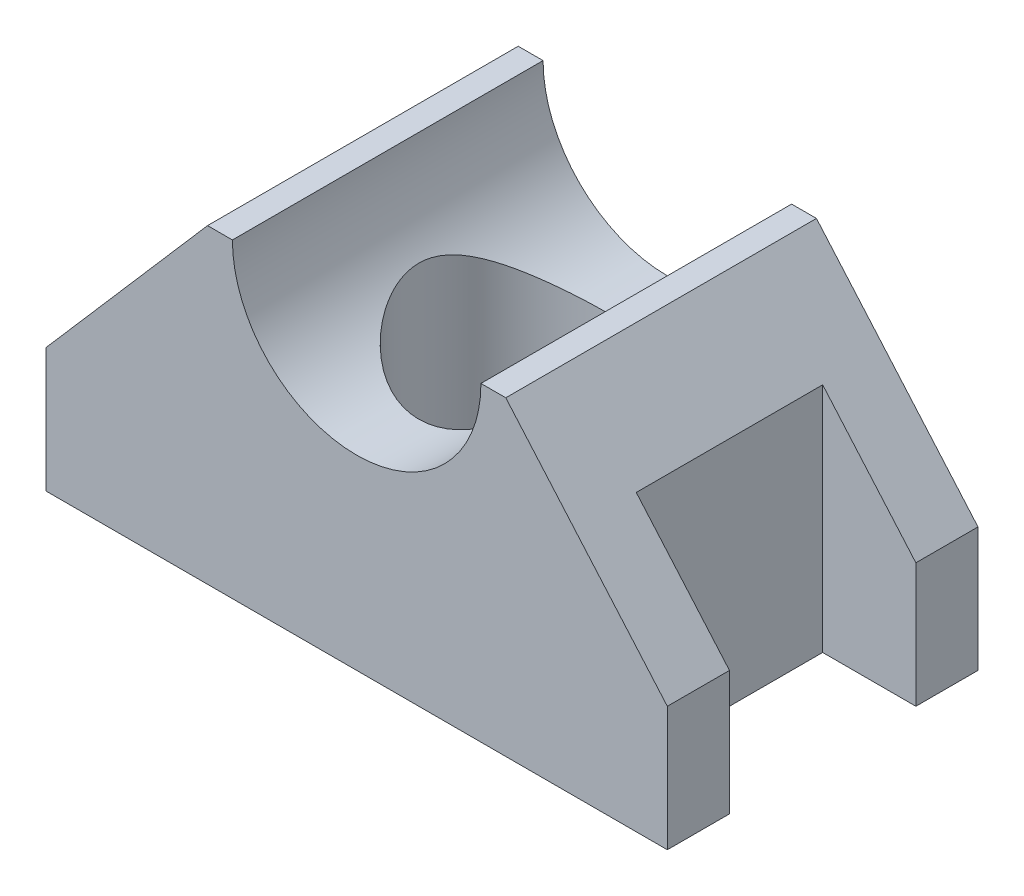
ISO-10303-21;
HEADER;
FILE_DESCRIPTION(('STEP AP214'),'2;1');
FILE_NAME('part.step','',(''),(''),'','','');
FILE_SCHEMA(('AUTOMOTIVE_DESIGN { 1 0 10303 214 1 1 1 1 }'));
ENDSEC;
DATA;
#1=APPLICATION_CONTEXT('core data for automotive mechanical design processes');
#2=APPLICATION_PROTOCOL_DEFINITION('international standard','automotive_design',2000,#1);
#3=PRODUCT_CONTEXT('',#1,'mechanical');
#4=PRODUCT('Part','Part','',(#3));
#5=PRODUCT_RELATED_PRODUCT_CATEGORY('part','',(#4));
#6=PRODUCT_DEFINITION_FORMATION('','',#4);
#7=PRODUCT_DEFINITION_CONTEXT('part definition',#1,'design');
#8=PRODUCT_DEFINITION('design','',#6,#7);
#9=PRODUCT_DEFINITION_SHAPE('','',#8);
#10=(LENGTH_UNIT() NAMED_UNIT(*) SI_UNIT(.MILLI.,.METRE.));
#11=(NAMED_UNIT(*) PLANE_ANGLE_UNIT() SI_UNIT($,.RADIAN.));
#12=(NAMED_UNIT(*) SI_UNIT($,.STERADIAN.) SOLID_ANGLE_UNIT());
#13=UNCERTAINTY_MEASURE_WITH_UNIT(LENGTH_MEASURE(1.E-05),#10,'distance_accuracy_value','');
#14=(GEOMETRIC_REPRESENTATION_CONTEXT(3) GLOBAL_UNCERTAINTY_ASSIGNED_CONTEXT((#13)) GLOBAL_UNIT_ASSIGNED_CONTEXT((#10,
#11,#12)) REPRESENTATION_CONTEXT('',''));
#15=CARTESIAN_POINT('',(0.,0.,0.));
#16=DIRECTION('',(0.,0.,1.));
#17=DIRECTION('',(1.,0.,0.));
#18=AXIS2_PLACEMENT_3D('',#15,#16,#17);
#19=CARTESIAN_POINT('',(-68.1528429856967,0.,-50.));
#20=DIRECTION('',(0.,-1.,0.));
#21=DIRECTION('',(0.,0.,-1.));
#22=AXIS2_PLACEMENT_3D('',#19,#20,#21);
#23=PLANE('',#22);
#24=CARTESIAN_POINT('',(-18.1528429856966,0.,-25.));
#25=DIRECTION('',(0.,1.,0.));
#26=DIRECTION('',(-1.,0.,0.));
#27=AXIS2_PLACEMENT_3D('',#24,#25,#26);
#28=CIRCLE('',#27,15.);
#29=CARTESIAN_POINT('',(-33.1528429856966,0.,-25.));
#30=VERTEX_POINT('',#29);
#31=EDGE_CURVE('E242',#30,#30,#28,.T.);
#32=ORIENTED_EDGE('',*,*,#31,.T.);
#33=EDGE_LOOP('',(#32));
#34=FACE_BOUND('',#33,.T.);
#35=DIRECTION('',(0.,0.,1.));
#36=VECTOR('',#35,1.);
#37=CARTESIAN_POINT('',(31.8471570143033,0.,-50.));
#38=LINE('',#37,#36);
#39=CARTESIAN_POINT('',(31.8471570143033,0.,-50.));
#40=VERTEX_POINT('',#39);
#41=CARTESIAN_POINT('',(31.8471570143033,0.,-40.));
#42=VERTEX_POINT('',#41);
#43=EDGE_CURVE('E173',#40,#42,#38,.T.);
#44=ORIENTED_EDGE('',*,*,#43,.T.);
#45=DIRECTION('',(1.,0.,0.));
#46=VECTOR('',#45,1.);
#47=CARTESIAN_POINT('',(16.8471570143033,0.,-40.));
#48=LINE('',#47,#46);
#49=CARTESIAN_POINT('',(16.8471570143033,0.,-40.));
#50=VERTEX_POINT('',#49);
#51=EDGE_CURVE('E157',#50,#42,#48,.T.);
#52=ORIENTED_EDGE('',*,*,#51,.F.);
#53=DIRECTION('',(0.,0.,1.));
#54=VECTOR('',#53,1.);
#55=CARTESIAN_POINT('',(16.8471570143033,0.,-40.));
#56=LINE('',#55,#54);
#57=CARTESIAN_POINT('',(16.8471570143033,0.,-10.));
#58=VERTEX_POINT('',#57);
#59=EDGE_CURVE('E245',#50,#58,#56,.T.);
#60=ORIENTED_EDGE('',*,*,#59,.T.);
#61=DIRECTION('',(1.,0.,0.));
#62=VECTOR('',#61,1.);
#63=CARTESIAN_POINT('',(16.8471570143033,0.,-10.));
#64=LINE('',#63,#62);
#65=CARTESIAN_POINT('',(31.8471570143033,0.,-10.));
#66=VERTEX_POINT('',#65);
#67=EDGE_CURVE('E260',#58,#66,#64,.T.);
#68=ORIENTED_EDGE('',*,*,#67,.T.);
#69=CARTESIAN_POINT('',(31.8471570143033,0.,0.));
#70=VERTEX_POINT('',#69);
#71=EDGE_CURVE('E182',#66,#70,#38,.T.);
#72=ORIENTED_EDGE('',*,*,#71,.T.);
#73=DIRECTION('',(1.,0.,0.));
#74=VECTOR('',#73,1.);
#75=CARTESIAN_POINT('',(-68.1528429856967,0.,0.));
#76=LINE('',#75,#74);
#77=CARTESIAN_POINT('',(-68.1528429856967,0.,0.));
#78=VERTEX_POINT('',#77);
#79=EDGE_CURVE('E219',#78,#70,#76,.T.);
#80=ORIENTED_EDGE('',*,*,#79,.F.);
#81=DIRECTION('',(0.,0.,1.));
#82=VECTOR('',#81,1.);
#83=CARTESIAN_POINT('',(-68.1528429856967,0.,-50.));
#84=LINE('',#83,#82);
#85=CARTESIAN_POINT('',(-68.1528429856967,0.,-10.));
#86=VERTEX_POINT('',#85);
#87=EDGE_CURVE('E50',#86,#78,#84,.T.);
#88=ORIENTED_EDGE('',*,*,#87,.F.);
#89=DIRECTION('',(1.,0.,0.));
#90=VECTOR('',#89,1.);
#91=CARTESIAN_POINT('',(-53.1528429856967,0.,-10.));
#92=LINE('',#91,#90);
#93=CARTESIAN_POINT('',(-53.1528429856967,0.,-10.));
#94=VERTEX_POINT('',#93);
#95=EDGE_CURVE('E257',#86,#94,#92,.T.);
#96=ORIENTED_EDGE('',*,*,#95,.T.);
#97=DIRECTION('',(0.,0.,1.));
#98=VECTOR('',#97,1.);
#99=CARTESIAN_POINT('',(-53.1528429856967,0.,-40.));
#100=LINE('',#99,#98);
#101=CARTESIAN_POINT('',(-53.1528429856967,0.,-40.));
#102=VERTEX_POINT('',#101);
#103=EDGE_CURVE('E256',#102,#94,#100,.T.);
#104=ORIENTED_EDGE('',*,*,#103,.F.);
#105=DIRECTION('',(1.,0.,0.));
#106=VECTOR('',#105,1.);
#107=CARTESIAN_POINT('',(-53.1528429856967,0.,-40.));
#108=LINE('',#107,#106);
#109=CARTESIAN_POINT('',(-68.1528429856967,0.,-40.));
#110=VERTEX_POINT('',#109);
#111=EDGE_CURVE('E246',#110,#102,#108,.T.);
#112=ORIENTED_EDGE('',*,*,#111,.F.);
#113=CARTESIAN_POINT('',(-68.1528429856967,0.,-50.));
#114=VERTEX_POINT('',#113);
#115=EDGE_CURVE('E11',#114,#110,#84,.T.);
#116=ORIENTED_EDGE('',*,*,#115,.F.);
#117=DIRECTION('',(1.,0.,0.));
#118=VECTOR('',#117,1.);
#119=CARTESIAN_POINT('',(-68.1528429856967,0.,-50.));
#120=LINE('',#119,#118);
#121=EDGE_CURVE('E180',#114,#40,#120,.T.);
#122=ORIENTED_EDGE('',*,*,#121,.T.);
#123=EDGE_LOOP('',(#44,#52,#60,#68,#72,#80,#88,#96,#104,#112,#116,#122));
#124=FACE_BOUND('',#123,.T.);
#125=ADVANCED_FACE('F37',(#34,#124),#23,.T.);
#126=CARTESIAN_POINT('',(-68.1528429856967,0.,-50.));
#127=DIRECTION('',(-1.,0.,0.));
#128=DIRECTION('',(0.,0.,1.));
#129=AXIS2_PLACEMENT_3D('',#126,#127,#128);
#130=PLANE('',#129);
#131=DIRECTION('',(0.,0.,1.));
#132=VECTOR('',#131,1.);
#133=CARTESIAN_POINT('',(-68.1528429856967,20.,-50.));
#134=LINE('',#133,#132);
#135=CARTESIAN_POINT('',(-68.1528429856967,20.,-10.));
#136=VERTEX_POINT('',#135);
#137=CARTESIAN_POINT('',(-68.1528429856967,20.,0.));
#138=VERTEX_POINT('',#137);
#139=EDGE_CURVE('E194',#136,#138,#134,.T.);
#140=ORIENTED_EDGE('',*,*,#139,.F.);
#141=DIRECTION('',(0.,-1.,0.));
#142=VECTOR('',#141,1.);
#143=CARTESIAN_POINT('',(-68.1528429856967,0.,-10.));
#144=LINE('',#143,#142);
#145=EDGE_CURVE('E58',#136,#86,#144,.T.);
#146=ORIENTED_EDGE('',*,*,#145,.T.);
#147=ORIENTED_EDGE('',*,*,#87,.T.);
#148=DIRECTION('',(0.,-1.,0.));
#149=VECTOR('',#148,1.);
#150=CARTESIAN_POINT('',(-68.1528429856967,0.,0.));
#151=LINE('',#150,#149);
#152=EDGE_CURVE('E198',#138,#78,#151,.T.);
#153=ORIENTED_EDGE('',*,*,#152,.F.);
#154=EDGE_LOOP('',(#140,#146,#147,#153));
#155=FACE_BOUND('',#154,.T.);
#156=ADVANCED_FACE('F302',(#155),#130,.T.);
#157=CARTESIAN_POINT('',(31.8471570143033,20.,-50.));
#158=DIRECTION('',(0.755689082789817,0.654930538417842,0.));
#159=DIRECTION('',(-0.654930538417842,0.755689082789817,0.));
#160=AXIS2_PLACEMENT_3D('',#157,#158,#159);
#161=PLANE('',#160);
#162=DIRECTION('',(0.,0.,1.));
#163=VECTOR('',#162,1.);
#164=CARTESIAN_POINT('',(16.8471570143033,37.3076923076923,-40.));
#165=LINE('',#164,#163);
#166=CARTESIAN_POINT('',(16.8471570143033,37.3076923076923,-40.));
#167=VERTEX_POINT('',#166);
#168=CARTESIAN_POINT('',(16.8471570143033,37.3076923076923,-10.));
#169=VERTEX_POINT('',#168);
#170=EDGE_CURVE('E271',#167,#169,#165,.T.);
#171=ORIENTED_EDGE('',*,*,#170,.F.);
#172=DIRECTION('',(-0.654930538417842,0.755689082789818,0.));
#173=VECTOR('',#172,1.);
#174=CARTESIAN_POINT('',(31.8471570143033,20.,-40.));
#175=LINE('',#174,#173);
#176=CARTESIAN_POINT('',(31.8471570143033,20.,-40.));
#177=VERTEX_POINT('',#176);
#178=EDGE_CURVE('E176',#177,#167,#175,.T.);
#179=ORIENTED_EDGE('',*,*,#178,.F.);
#180=DIRECTION('',(0.,0.,1.));
#181=VECTOR('',#180,1.);
#182=CARTESIAN_POINT('',(31.8471570143033,20.,-50.));
#183=LINE('',#182,#181);
#184=CARTESIAN_POINT('',(31.8471570143033,20.,-50.));
#185=VERTEX_POINT('',#184);
#186=EDGE_CURVE('E175',#185,#177,#183,.T.);
#187=ORIENTED_EDGE('',*,*,#186,.F.);
#188=DIRECTION('',(-0.654930538417842,0.755689082789817,0.));
#189=VECTOR('',#188,1.);
#190=CARTESIAN_POINT('',(31.8471570143033,20.,-50.));
#191=LINE('',#190,#189);
#192=CARTESIAN_POINT('',(5.84715701430327,50.,-50.));
#193=VERTEX_POINT('',#192);
#194=EDGE_CURVE('E236',#185,#193,#191,.T.);
#195=ORIENTED_EDGE('',*,*,#194,.T.);
#196=DIRECTION('',(0.,0.,1.));
#197=VECTOR('',#196,1.);
#198=CARTESIAN_POINT('',(5.84715701430327,50.,-50.));
#199=LINE('',#198,#197);
#200=CARTESIAN_POINT('',(5.84715701430327,50.,0.));
#201=VERTEX_POINT('',#200);
#202=EDGE_CURVE('E186',#193,#201,#199,.T.);
#203=ORIENTED_EDGE('',*,*,#202,.T.);
#204=DIRECTION('',(-0.654930538417842,0.755689082789817,0.));
#205=VECTOR('',#204,1.);
#206=CARTESIAN_POINT('',(31.8471570143033,20.,0.));
#207=LINE('',#206,#205);
#208=CARTESIAN_POINT('',(31.8471570143033,20.,0.));
#209=VERTEX_POINT('',#208);
#210=EDGE_CURVE('E213',#209,#201,#207,.T.);
#211=ORIENTED_EDGE('',*,*,#210,.F.);
#212=CARTESIAN_POINT('',(31.8471570143033,20.,-10.));
#213=VERTEX_POINT('',#212);
#214=EDGE_CURVE('E181',#213,#209,#183,.T.);
#215=ORIENTED_EDGE('',*,*,#214,.F.);
#216=DIRECTION('',(-0.654930538417842,0.755689082789818,0.));
#217=VECTOR('',#216,1.);
#218=CARTESIAN_POINT('',(31.8471570143033,20.,-10.));
#219=LINE('',#218,#217);
#220=EDGE_CURVE('E66',#213,#169,#219,.T.);
#221=ORIENTED_EDGE('',*,*,#220,.T.);
#222=EDGE_LOOP('',(#171,#179,#187,#195,#203,#211,#215,#221));
#223=FACE_BOUND('',#222,.T.);
#224=ADVANCED_FACE('F286',(#223),#161,.T.);
#225=CARTESIAN_POINT('',(31.8471570143033,0.,-50.));
#226=DIRECTION('',(1.,0.,0.));
#227=DIRECTION('',(0.,0.,-1.));
#228=AXIS2_PLACEMENT_3D('',#225,#226,#227);
#229=PLANE('',#228);
#230=ORIENTED_EDGE('',*,*,#186,.T.);
#231=DIRECTION('',(0.,1.,0.));
#232=VECTOR('',#231,1.);
#233=CARTESIAN_POINT('',(31.8471570143033,0.,-40.));
#234=LINE('',#233,#232);
#235=EDGE_CURVE('E160',#42,#177,#234,.T.);
#236=ORIENTED_EDGE('',*,*,#235,.F.);
#237=ORIENTED_EDGE('',*,*,#43,.F.);
#238=DIRECTION('',(0.,1.,0.));
#239=VECTOR('',#238,1.);
#240=CARTESIAN_POINT('',(31.8471570143033,0.,-50.));
#241=LINE('',#240,#239);
#242=EDGE_CURVE('E239',#40,#185,#241,.T.);
#243=ORIENTED_EDGE('',*,*,#242,.T.);
#244=EDGE_LOOP('',(#230,#236,#237,#243));
#245=FACE_BOUND('',#244,.T.);
#246=ADVANCED_FACE('F171',(#245),#229,.T.);
#247=DIRECTION('',(0.,-1.,0.));
#248=VECTOR('',#247,1.);
#249=CARTESIAN_POINT('',(-68.1528429856967,0.,-40.));
#250=LINE('',#249,#248);
#251=CARTESIAN_POINT('',(-68.1528429856967,20.,-40.));
#252=VERTEX_POINT('',#251);
#253=EDGE_CURVE('E254',#252,#110,#250,.T.);
#254=ORIENTED_EDGE('',*,*,#253,.F.);
#255=CARTESIAN_POINT('',(-68.1528429856967,20.,-50.));
#256=VERTEX_POINT('',#255);
#257=EDGE_CURVE('E195',#256,#252,#134,.T.);
#258=ORIENTED_EDGE('',*,*,#257,.F.);
#259=DIRECTION('',(0.,-1.,0.));
#260=VECTOR('',#259,1.);
#261=CARTESIAN_POINT('',(-68.1528429856967,0.,-50.));
#262=LINE('',#261,#260);
#263=EDGE_CURVE('E184',#256,#114,#262,.T.);
#264=ORIENTED_EDGE('',*,*,#263,.T.);
#265=ORIENTED_EDGE('',*,*,#115,.T.);
#266=EDGE_LOOP('',(#254,#258,#264,#265));
#267=FACE_BOUND('',#266,.T.);
#268=ADVANCED_FACE('F315',(#267),#130,.T.);
#269=CARTESIAN_POINT('',(-68.1528429856967,20.,-50.));
#270=DIRECTION('',(-0.755689082789818,0.654930538417842,0.));
#271=DIRECTION('',(-0.654930538417842,-0.755689082789817,0.));
#272=AXIS2_PLACEMENT_3D('',#269,#270,#271);
#273=PLANE('',#272);
#274=DIRECTION('',(-0.654930538417842,-0.755689082789818,0.));
#275=VECTOR('',#274,1.);
#276=CARTESIAN_POINT('',(-68.1528429856967,20.,-40.));
#277=LINE('',#276,#275);
#278=CARTESIAN_POINT('',(-53.1528429856967,37.3076923076923,-40.));
#279=VERTEX_POINT('',#278);
#280=EDGE_CURVE('E252',#279,#252,#277,.T.);
#281=ORIENTED_EDGE('',*,*,#280,.F.);
#282=DIRECTION('',(0.,0.,1.));
#283=VECTOR('',#282,1.);
#284=CARTESIAN_POINT('',(-53.1528429856967,37.3076923076923,-40.));
#285=LINE('',#284,#283);
#286=CARTESIAN_POINT('',(-53.1528429856967,37.3076923076923,-10.));
#287=VERTEX_POINT('',#286);
#288=EDGE_CURVE('E267',#279,#287,#285,.T.);
#289=ORIENTED_EDGE('',*,*,#288,.T.);
#290=DIRECTION('',(-0.654930538417842,-0.755689082789818,0.));
#291=VECTOR('',#290,1.);
#292=CARTESIAN_POINT('',(-68.1528429856967,20.,-10.));
#293=LINE('',#292,#291);
#294=EDGE_CURVE('E264',#287,#136,#293,.T.);
#295=ORIENTED_EDGE('',*,*,#294,.T.);
#296=ORIENTED_EDGE('',*,*,#139,.T.);
#297=DIRECTION('',(-0.654930538417842,-0.755689082789818,0.));
#298=VECTOR('',#297,1.);
#299=CARTESIAN_POINT('',(-68.1528429856967,20.,0.));
#300=LINE('',#299,#298);
#301=CARTESIAN_POINT('',(-42.1528429856967,50.,0.));
#302=VERTEX_POINT('',#301);
#303=EDGE_CURVE('E201',#302,#138,#300,.T.);
#304=ORIENTED_EDGE('',*,*,#303,.F.);
#305=DIRECTION('',(0.,0.,1.));
#306=VECTOR('',#305,1.);
#307=CARTESIAN_POINT('',(-42.1528429856967,50.,-50.));
#308=LINE('',#307,#306);
#309=CARTESIAN_POINT('',(-42.1528429856967,50.,-50.));
#310=VERTEX_POINT('',#309);
#311=EDGE_CURVE('E192',#310,#302,#308,.T.);
#312=ORIENTED_EDGE('',*,*,#311,.F.);
#313=DIRECTION('',(-0.654930538417842,-0.755689082789818,0.));
#314=VECTOR('',#313,1.);
#315=CARTESIAN_POINT('',(-68.1528429856967,20.,-50.));
#316=LINE('',#315,#314);
#317=EDGE_CURVE('E224',#310,#256,#316,.T.);
#318=ORIENTED_EDGE('',*,*,#317,.T.);
#319=ORIENTED_EDGE('',*,*,#257,.T.);
#320=EDGE_LOOP('',(#281,#289,#295,#296,#304,#312,#318,#319));
#321=FACE_BOUND('',#320,.T.);
#322=ADVANCED_FACE('F305',(#321),#273,.T.);
#323=CARTESIAN_POINT('',(-42.1528429856967,50.,-50.));
#324=DIRECTION('',(0.,1.,0.));
#325=DIRECTION('',(-1.,0.,0.));
#326=AXIS2_PLACEMENT_3D('',#323,#324,#325);
#327=PLANE('',#326);
#328=DIRECTION('',(-1.,0.,0.));
#329=VECTOR('',#328,1.);
#330=CARTESIAN_POINT('',(-42.1528429856967,50.,0.));
#331=LINE('',#330,#329);
#332=CARTESIAN_POINT('',(-38.1528429856967,50.,0.));
#333=VERTEX_POINT('',#332);
#334=EDGE_CURVE('E204',#333,#302,#331,.T.);
#335=ORIENTED_EDGE('',*,*,#334,.F.);
#336=DIRECTION('',(0.,0.,1.));
#337=VECTOR('',#336,1.);
#338=CARTESIAN_POINT('',(-38.1528429856967,50.,-50.));
#339=LINE('',#338,#337);
#340=CARTESIAN_POINT('',(-38.1528429856967,50.,-50.));
#341=VERTEX_POINT('',#340);
#342=EDGE_CURVE('E190',#341,#333,#339,.T.);
#343=ORIENTED_EDGE('',*,*,#342,.F.);
#344=DIRECTION('',(-1.,0.,0.));
#345=VECTOR('',#344,1.);
#346=CARTESIAN_POINT('',(-42.1528429856967,50.,-50.));
#347=LINE('',#346,#345);
#348=EDGE_CURVE('E227',#341,#310,#347,.T.);
#349=ORIENTED_EDGE('',*,*,#348,.T.);
#350=ORIENTED_EDGE('',*,*,#311,.T.);
#351=EDGE_LOOP('',(#335,#343,#349,#350));
#352=FACE_BOUND('',#351,.T.);
#353=ADVANCED_FACE('F332',(#352),#327,.T.);
#354=CARTESIAN_POINT('',(-18.1528429856967,50.,-50.));
#355=DIRECTION('',(0.,0.,1.));
#356=DIRECTION('',(1.,0.,0.));
#357=AXIS2_PLACEMENT_3D('',#354,#355,#356);
#358=CYLINDRICAL_SURFACE('',#357,20.);
#359=CARTESIAN_POINT('',(-33.1528429856967,36.771243444677,-25.));
#360=CARTESIAN_POINT('',(-33.1528380010224,36.771233190538,-24.6499201096727));
#361=CARTESIAN_POINT('',(-33.1405514519498,36.7572656815998,-24.2997632861544));
#362=CARTESIAN_POINT('',(-33.0917560279439,36.7022496761937,-23.6032567029206));
#363=CARTESIAN_POINT('',(-33.0552390714763,36.6611921444534,-23.2569082525997));
#364=CARTESIAN_POINT('',(-32.9588730024205,36.5543082639588,-22.5706321375989));
#365=CARTESIAN_POINT('',(-32.898973078825,36.4884279864902,-22.2307201574515));
#366=CARTESIAN_POINT('',(-32.7571553912842,36.3352675335299,-21.5602923841232));
#367=CARTESIAN_POINT('',(-32.6752230853698,36.2479732275511,-21.2297829567759));
#368=CARTESIAN_POINT('',(-32.4921093235864,36.0571649871801,-20.5845351983311));
#369=CARTESIAN_POINT('',(-32.3912196707704,35.9539006586822,-20.2696389891249));
#370=CARTESIAN_POINT('',(-32.1707417710639,35.7338599990509,-19.6515269245116));
#371=CARTESIAN_POINT('',(-32.05116003428,35.6170883759255,-19.3483070481083));
#372=CARTESIAN_POINT('',(-31.7943311406866,35.3732730645817,-18.7538305661832));
#373=CARTESIAN_POINT('',(-31.6570870634224,35.2462311684854,-18.4625718867983));
#374=CARTESIAN_POINT('',(-31.3657223802159,34.9847360394552,-17.8920877594194));
#375=CARTESIAN_POINT('',(-31.2116005500544,34.8502822692565,-17.612863186363));
#376=CARTESIAN_POINT('',(-30.8530832726936,34.5478224335567,-17.0092804371543));
#377=CARTESIAN_POINT('',(-30.6449197524024,34.378688059583,-16.6877210227656));
#378=CARTESIAN_POINT('',(-30.2055481062483,34.0372387052375,-16.0625345701029));
#379=CARTESIAN_POINT('',(-29.9743380847334,33.86492346418,-15.7589090102251));
#380=CARTESIAN_POINT('',(-29.4890437535547,33.5203387275524,-15.1696169416439));
#381=CARTESIAN_POINT('',(-29.2349277777089,33.348069636033,-14.8839762514164));
#382=CARTESIAN_POINT('',(-28.7044848878648,33.006992121648,-14.3318502186352));
#383=CARTESIAN_POINT('',(-28.4281561314609,32.8381839873067,-14.065366468505));
#384=CARTESIAN_POINT('',(-27.7948641009056,32.4731380870255,-13.5001513053482));
#385=CARTESIAN_POINT('',(-27.4329682310191,32.2783518773303,-13.2059720921013));
#386=CARTESIAN_POINT('',(-26.6782980134743,31.9031988101789,-12.6494361506199));
#387=CARTESIAN_POINT('',(-26.2855167543762,31.7228351984855,-12.3870865787187));
#388=CARTESIAN_POINT('',(-25.4713838272965,31.3819080902793,-11.8979378631658));
#389=CARTESIAN_POINT('',(-25.0500881574305,31.2213074362451,-11.6710717801801));
#390=CARTESIAN_POINT('',(-24.1807604256903,30.9244963398501,-11.2560604044606));
#391=CARTESIAN_POINT('',(-23.7327426701154,30.7882730000465,-11.0678946284221));
#392=CARTESIAN_POINT('',(-22.9523853798468,30.5815882297625,-10.7844793818981));
#393=CARTESIAN_POINT('',(-22.6259285581093,30.5036861880446,-10.6783248496916));
#394=CARTESIAN_POINT('',(-21.9634297273718,30.3634532848,-10.4880008608475));
#395=CARTESIAN_POINT('',(-21.6273900256884,30.3011187097043,-10.4038261607732));
#396=CARTESIAN_POINT('',(-20.9479182942261,30.1932888291835,-10.2586239130163));
#397=CARTESIAN_POINT('',(-20.6044913613367,30.1477822839984,-10.1975809145554));
#398=CARTESIAN_POINT('',(-19.9123304488417,30.0745061811935,-10.0994506319975));
#399=CARTESIAN_POINT('',(-19.5635962794576,30.0467372593769,-10.0623642066209));
#400=CARTESIAN_POINT('',(-18.8624863295614,30.0095032917063,-10.0126642993132));
#401=CARTESIAN_POINT('',(-18.5101034010628,30.0000864009269,-10.0001152021709));
#402=CARTESIAN_POINT('',(-17.8053262101727,29.9999147858045,-9.99988638013759));
#403=CARTESIAN_POINT('',(-17.4529319478316,30.0091599876129,-10.0122065568352));
#404=CARTESIAN_POINT('',(-16.7507880486269,30.0461064535884,-10.0615217230337));
#405=CARTESIAN_POINT('',(-16.4010389483623,30.073811366045,-10.098521590113));
#406=CARTESIAN_POINT('',(-15.706847707787,30.1470674658215,-10.1966222259398));
#407=CARTESIAN_POINT('',(-15.3624055322702,30.1926185346965,-10.2577228347309));
#408=CARTESIAN_POINT('',(-14.6928951100272,30.2987390961117,-10.4006203440397));
#409=CARTESIAN_POINT('',(-14.3675679235524,30.3587383697719,-10.4816334245986));
#410=CARTESIAN_POINT('',(-13.7258778696304,30.493348387565,-10.6642661518031));
#411=CARTESIAN_POINT('',(-13.4095147326248,30.5679586917941,-10.7658851780553));
#412=CARTESIAN_POINT('',(-12.7872435971688,30.7304963527287,-10.9885916023426));
#413=CARTESIAN_POINT('',(-12.4813361322191,30.8184243877322,-11.1096799920096));
#414=CARTESIAN_POINT('',(-11.8811642228862,31.0061867165046,-11.3701398243136));
#415=CARTESIAN_POINT('',(-11.5869013731856,31.1060226335464,-11.5095137598809));
#416=CARTESIAN_POINT('',(-10.9798128086138,31.327479636423,-11.8213677585346));
#417=CARTESIAN_POINT('',(-10.6684227149696,31.4502890709067,-11.9957981628215));
#418=CARTESIAN_POINT('',(-10.0620398171052,31.7066326806807,-12.3641469460698));
#419=CARTESIAN_POINT('',(-9.76704801449605,31.8401675098651,-12.5580665134066));
#420=CARTESIAN_POINT('',(-9.19391161253139,32.1159638285806,-12.9641789305854));
#421=CARTESIAN_POINT('',(-8.91577833756535,32.2582310576003,-13.1763838365251));
#422=CARTESIAN_POINT('',(-8.37699168791975,32.5493119773301,-13.6178188869647));
#423=CARTESIAN_POINT('',(-8.11634008517579,32.6981263291301,-13.8470507523628));
#424=CARTESIAN_POINT('',(-7.56330088527284,33.0298794232253,-14.3683008313751));
#425=CARTESIAN_POINT('',(-7.27475734097072,33.2137720938178,-14.6637992845667));
#426=CARTESIAN_POINT('',(-6.72361420061857,33.5840634745931,-15.2766961615462));
#427=CARTESIAN_POINT('',(-6.46101962257245,33.7704626615987,-15.5940988010832));
#428=CARTESIAN_POINT('',(-5.96223463137609,34.141697659307,-16.2502008454954));
#429=CARTESIAN_POINT('',(-5.72605825544724,34.3265325910898,-16.5889114243426));
#430=CARTESIAN_POINT('',(-5.28110095817036,34.6898500613678,-17.287052359389));
#431=CARTESIAN_POINT('',(-5.0723139167883,34.8683340124456,-17.6464780609557));
#432=CARTESIAN_POINT('',(-4.72167329119984,35.1794968986786,-18.3129870477236));
#433=CARTESIAN_POINT('',(-4.57473811596952,35.3142702665546,-18.6164242037953));
#434=CARTESIAN_POINT('',(-4.30017615150849,35.5729702671938,-19.2364459405753));
#435=CARTESIAN_POINT('',(-4.1725491433171,35.6968970229543,-19.5530303721374));
#436=CARTESIAN_POINT('',(-3.93799393227425,35.9299833544444,-20.1983639901004));
#437=CARTESIAN_POINT('',(-3.83102769454004,36.0391699518696,-20.5270894702104));
#438=CARTESIAN_POINT('',(-3.63893431521989,36.2389790350307,-21.1963760099401));
#439=CARTESIAN_POINT('',(-3.55380147936701,36.3296063598784,-21.5369339572263));
#440=CARTESIAN_POINT('',(-3.42147503849008,36.4724610286935,-22.1597356530325));
#441=CARTESIAN_POINT('',(-3.37010649864386,36.5287389205499,-22.440165027475));
#442=CARTESIAN_POINT('',(-3.28317573276782,36.6247538122938,-23.0062701655176));
#443=CARTESIAN_POINT('',(-3.24761148340931,36.6644929295001,-23.2919452526614));
#444=CARTESIAN_POINT('',(-3.19295115256775,36.7258395015415,-23.8665044168382));
#445=CARTESIAN_POINT('',(-3.17383720257552,36.7474666291436,-24.1553846659036));
#446=CARTESIAN_POINT('',(-3.15239217780697,36.7717444366894,-24.7345781691211));
#447=CARTESIAN_POINT('',(-3.15006127562221,36.7743949214833,-25.0248914379792));
#448=CARTESIAN_POINT('',(-3.16223392269728,36.7605996953514,-25.6047989187594));
#449=CARTESIAN_POINT('',(-3.17674301300417,36.7441476989265,-25.8943928625659));
#450=CARTESIAN_POINT('',(-3.22230878409748,36.6928473427935,-26.4706086946157));
#451=CARTESIAN_POINT('',(-3.25336548384367,36.6579989620074,-26.7572305794535));
#452=CARTESIAN_POINT('',(-3.33150022173873,36.5712550138894,-27.3260086841822));
#453=CARTESIAN_POINT('',(-3.37859808663761,36.5193383530733,-27.6081589233274));
#454=CARTESIAN_POINT('',(-3.48808078024124,36.400320793961,-28.1663419877183));
#455=CARTESIAN_POINT('',(-3.55047457595712,36.3332109906842,-28.4423711206761));
#456=CARTESIAN_POINT('',(-3.71580462069189,36.1583487725681,-29.0891566733594));
#457=CARTESIAN_POINT('',(-3.82517505703457,36.0447850907916,-29.4567076603978));
#458=CARTESIAN_POINT('',(-4.06922511541464,35.7985311688328,-30.1765077556688));
#459=CARTESIAN_POINT('',(-4.20390480898238,35.6658408745941,-30.5287568206508));
#460=CARTESIAN_POINT('',(-4.49716581404244,35.3861849035335,-31.217953860012));
#461=CARTESIAN_POINT('',(-4.65578487326334,35.2391968143559,-31.554876555919));
#462=CARTESIAN_POINT('',(-4.99549120771327,34.9356052244397,-32.2125645061097));
#463=CARTESIAN_POINT('',(-5.17657645360878,34.7790025928116,-32.5333312160622));
#464=CARTESIAN_POINT('',(-5.56714988540666,34.4543547842719,-33.1697382046182));
#465=CARTESIAN_POINT('',(-5.77741808236465,34.2861007571528,-33.4847923933616));
#466=CARTESIAN_POINT('',(-6.22042020557973,33.9471156315956,-34.0972592787217));
#467=CARTESIAN_POINT('',(-6.4531542186459,33.7763845235882,-34.3946719071635));
#468=CARTESIAN_POINT('',(-6.94073430097617,33.4356674231039,-34.9715238354586));
#469=CARTESIAN_POINT('',(-7.19559005475786,33.2656817915424,-35.2509551692435));
#470=CARTESIAN_POINT('',(-7.72697091806968,32.9295557435982,-35.7909545658109));
#471=CARTESIAN_POINT('',(-8.00349848325566,32.7634157657414,-36.0515204844792));
#472=CARTESIAN_POINT('',(-8.64065043379421,32.4022743773411,-36.6074930001012));
#473=CARTESIAN_POINT('',(-9.00644708491827,32.2088996414861,-36.8980704729062));
#474=CARTESIAN_POINT('',(-9.76880219921328,31.8371883381825,-37.4470273815066));
#475=CARTESIAN_POINT('',(-10.1653676121622,31.6588551872909,-37.7053995084894));
#476=CARTESIAN_POINT('',(-10.9869324994667,31.3225697783145,-38.1861994708645));
#477=CARTESIAN_POINT('',(-11.4118822213543,31.164583209862,-38.4086879809183));
#478=CARTESIAN_POINT('',(-12.2881743793093,30.8736187757728,-38.8144291894275));
#479=CARTESIAN_POINT('',(-12.7395024029468,30.7406274177908,-38.9977030632752));
#480=CARTESIAN_POINT('',(-13.523669247074,30.540269751948,-39.2718936292022));
#481=CARTESIAN_POINT('',(-13.8507140147573,30.4652542414124,-39.3739365835652));
#482=CARTESIAN_POINT('',(-14.5139997912993,30.3309071567981,-39.5559953401008));
#483=CARTESIAN_POINT('',(-14.8502385883798,30.2715718465823,-39.636016389643));
#484=CARTESIAN_POINT('',(-15.5296729741143,30.1697982764884,-39.7729141880237));
#485=CARTESIAN_POINT('',(-15.8728635260114,30.1273482126656,-39.8298071056262));
#486=CARTESIAN_POINT('',(-16.5641068620986,30.0601783683827,-39.9196977597463));
#487=CARTESIAN_POINT('',(-16.9121598274654,30.0354592503953,-39.952694603447));
#488=CARTESIAN_POINT('',(-17.6113684929995,30.0042615367585,-39.9943238587307));
#489=CARTESIAN_POINT('',(-17.9625295822607,29.9978261912995,-40.0028984998101));
#490=CARTESIAN_POINT('',(-18.6644359763644,30.0034640866753,-39.9953811079746));
#491=CARTESIAN_POINT('',(-19.0151812829954,30.0155372476079,-39.9792891815465));
#492=CARTESIAN_POINT('',(-19.7136544413013,30.0579258961832,-39.9226897715004));
#493=CARTESIAN_POINT('',(-20.0613815944952,30.0882454980593,-39.8821767813828));
#494=CARTESIAN_POINT('',(-20.7512083632986,30.166467781909,-39.777354847715));
#495=CARTESIAN_POINT('',(-21.0933079943489,30.2143704156294,-39.7130459694679));
#496=CARTESIAN_POINT('',(-21.7597352511777,30.3251150019709,-39.5637744447821));
#497=CARTESIAN_POINT('',(-22.0842902181367,30.3874805819145,-39.479468758544));
#498=CARTESIAN_POINT('',(-22.7241607109387,30.5266781443698,-39.2903589794546));
#499=CARTESIAN_POINT('',(-23.0394764804622,30.6035097449475,-39.1855554277881));
#500=CARTESIAN_POINT('',(-23.6594161218134,30.7703170569502,-38.956606108617));
#501=CARTESIAN_POINT('',(-23.9640395273119,30.8602933407768,-38.8324594987791));
#502=CARTESIAN_POINT('',(-24.5614491753983,31.0519603198084,-38.5660152984595));
#503=CARTESIAN_POINT('',(-24.8542337849326,31.1536526237343,-38.4237152150449));
#504=CARTESIAN_POINT('',(-25.4594738790644,31.3793415852686,-38.1050742462932));
#505=CARTESIAN_POINT('',(-25.7704049515222,31.5045599962374,-37.9267034353406));
#506=CARTESIAN_POINT('',(-26.3755644550329,31.7655418185335,-37.5504514430556));
#507=CARTESIAN_POINT('',(-26.6697918107693,31.9013059074189,-37.3525690078843));
#508=CARTESIAN_POINT('',(-27.2411364581179,32.1813522681874,-36.9384878595632));
#509=CARTESIAN_POINT('',(-27.5182410551527,32.3256407084952,-36.7222758322296));
#510=CARTESIAN_POINT('',(-28.0547013515242,32.620503163235,-36.272785147503));
#511=CARTESIAN_POINT('',(-28.3140552785162,32.7710778029134,-36.039504790692));
#512=CARTESIAN_POINT('',(-28.864234271742,33.1065282327395,-35.5090255588305));
#513=CARTESIAN_POINT('',(-29.1511348375372,33.2922967608427,-35.2083115792522));
#514=CARTESIAN_POINT('',(-29.6985618628042,33.6657968131182,-34.5848079392062));
#515=CARTESIAN_POINT('',(-29.9590829287911,33.8535287300982,-34.2620137867968));
#516=CARTESIAN_POINT('',(-30.4532270038294,34.2267174927167,-33.594936715442));
#517=CARTESIAN_POINT('',(-30.6868379666337,34.4121732865202,-33.2506442783629));
#518=CARTESIAN_POINT('',(-31.1261197493324,34.7758308643003,-32.541096859739));
#519=CARTESIAN_POINT('',(-31.3317977862906,34.9540345136569,-32.1758473277296));
#520=CARTESIAN_POINT('',(-31.6726455812626,35.2604085355269,-31.5056968014535));
#521=CARTESIAN_POINT('',(-31.813450174565,35.3910735333118,-31.2047954327093));
#522=CARTESIAN_POINT('',(-32.0762030909042,35.6412764354689,-30.5903200105818));
#523=CARTESIAN_POINT('',(-32.1981513662756,35.7608143117134,-30.2767459251666));
#524=CARTESIAN_POINT('',(-32.4217777380648,35.9849181193065,-29.6380731045496));
#525=CARTESIAN_POINT('',(-32.5235003437282,36.0895167800954,-29.3130015718212));
#526=CARTESIAN_POINT('',(-32.7056123536506,36.2801486868621,-28.6516319103323));
#527=CARTESIAN_POINT('',(-32.7860092174461,36.3661884225985,-28.3153377535985));
#528=CARTESIAN_POINT('',(-32.9037790949621,36.4938884402908,-27.7332074418908));
#529=CARTESIAN_POINT('',(-32.946855941499,36.5411652334011,-27.4897419061433));
#530=CARTESIAN_POINT('',(-33.0211243484429,36.6232558502238,-26.9989433993064));
#531=CARTESIAN_POINT('',(-33.0523182248863,36.6580721024633,-26.7516111916392));
#532=CARTESIAN_POINT('',(-33.1024002099094,36.7142118672555,-26.254259899736));
#533=CARTESIAN_POINT('',(-33.1212928596836,36.7355403589471,-26.0042418417122));
#534=CARTESIAN_POINT('',(-33.1465148284027,36.7640584691553,-25.5028289012645));
#535=CARTESIAN_POINT('',(-33.1528465657883,36.7712508094022,-25.2514342932262));
#536=CARTESIAN_POINT('',(-33.1528429856967,36.771243444677,-25.));
#537=B_SPLINE_CURVE_WITH_KNOTS('',3,(#359,#360,#361,#362,#363,#364,#365,#366,#367,#368,#369,
#370,#371,#372,#373,#374,#375,#376,#377,#378,#379,#380,#381,#382,#383,#384,#385,#386,#387,#388,
#389,#390,#391,#392,#393,#394,#395,#396,#397,#398,#399,#400,#401,#402,#403,#404,#405,#406,#407,
#408,#409,#410,#411,#412,#413,#414,#415,#416,#417,#418,#419,#420,#421,#422,#423,#424,#425,#426,
#427,#428,#429,#430,#431,#432,#433,#434,#435,#436,#437,#438,#439,#440,#441,#442,#443,#444,#445,
#446,#447,#448,#449,#450,#451,#452,#453,#454,#455,#456,#457,#458,#459,#460,#461,#462,#463,#464,
#465,#466,#467,#468,#469,#470,#471,#472,#473,#474,#475,#476,#477,#478,#479,#480,#481,#482,#483,
#484,#485,#486,#487,#488,#489,#490,#491,#492,#493,#494,#495,#496,#497,#498,#499,#500,#501,#502,
#503,#504,#505,#506,#507,#508,#509,#510,#511,#512,#513,#514,#515,#516,#517,#518,#519,#520,#521,
#522,#523,#524,#525,#526,#527,#528,#529,#530,#531,#532,#533,#534,#535,#536),.UNSPECIFIED.,.T.,
.F.,(4,2,2,2,2,2,2,2,2,2,2,2,2,2,2,2,2,2,2,2,2,2,2,2,2,2,2,2,2,2,2,2,2,2,2,2,2,2,2,2,2,2,2,2,2,
2,2,2,2,2,2,2,2,2,2,2,2,2,2,2,2,2,2,2,2,2,2,2,2,2,2,2,2,2,2,2,2,2,2,2,2,2,2,2,2,2,2,2,4),(0.,
1.04989330861709,2.10013696283711,3.15267560731799,4.20591066822568,5.24409491293171,
6.281918379648,7.3195611395482,8.35727921425456,9.61238500518648,10.8675941180988,
12.1245659086803,13.3816420646879,14.895830090393,16.4103579261517,17.9219932288366,
19.432826382225,20.4878122457488,21.5425462049,22.5965744093589,23.650640393229,
24.7074685043306,25.7642924334173,26.8213252901474,27.8783511314818,28.8990338141559,
29.9196857711868,30.9403897294914,31.9612329887077,33.0925115159599,34.2238590661888,
35.3559583421496,36.4881721943811,37.8431193809285,39.1983280761281,40.5542534701806,
41.9098753703415,42.9983087099469,44.0867297054509,45.1731274949134,46.259241657274,
47.1301725976505,48.0009920058081,48.870864321519,49.7407455827085,50.6109131516152,
51.4810817175366,52.3523297314392,53.2240897280181,54.4220718811339,55.6200574201004,
56.819952075842,58.019738425887,59.2621109686766,60.5044883122505,61.747412317177,
62.9904773633289,64.5051805768845,66.0202269199134,67.5326840275842,69.0443223554234,
70.0954081717345,71.1462433185058,72.1963425629495,73.2464810396973,74.299101554863,
75.3517175258254,76.4045709311071,77.4574214470615,78.4795702327715,79.501692035347,
80.5238583607714,81.5461652070039,82.6841827772842,83.822273525575,84.9611981580049,
86.1002363428389,87.4646132818957,88.8292686170741,90.1945324824978,91.5594429292264,
92.6296192030642,93.6997981820698,94.7675953717639,95.835018562395,96.5896437436554,
97.3441217702319,98.0983211110213,98.8523752264069),.UNSPECIFIED.);
#538=CARTESIAN_POINT('',(-33.1528429856967,36.771243444677,-25.));
#539=VERTEX_POINT('',#538);
#540=EDGE_CURVE('E40',#539,#539,#537,.T.);
#541=ORIENTED_EDGE('',*,*,#540,.F.);
#542=EDGE_LOOP('',(#541));
#543=FACE_BOUND('',#542,.T.);
#544=CARTESIAN_POINT('',(-18.1528429856967,50.,0.));
#545=DIRECTION('',(0.,0.,-1.));
#546=DIRECTION('',(1.,0.,0.));
#547=AXIS2_PLACEMENT_3D('',#544,#545,#546);
#548=CIRCLE('',#547,20.);
#549=CARTESIAN_POINT('',(1.84715701430327,50.,0.));
#550=VERTEX_POINT('',#549);
#551=EDGE_CURVE('E207',#550,#333,#548,.T.);
#552=ORIENTED_EDGE('',*,*,#551,.F.);
#553=DIRECTION('',(0.,0.,1.));
#554=VECTOR('',#553,1.);
#555=CARTESIAN_POINT('',(1.84715701430327,50.,-50.));
#556=LINE('',#555,#554);
#557=CARTESIAN_POINT('',(1.84715701430327,50.,-50.));
#558=VERTEX_POINT('',#557);
#559=EDGE_CURVE('E188',#558,#550,#556,.T.);
#560=ORIENTED_EDGE('',*,*,#559,.F.);
#561=CARTESIAN_POINT('',(-18.1528429856967,50.,-50.));
#562=DIRECTION('',(0.,0.,-1.));
#563=DIRECTION('',(1.,0.,0.));
#564=AXIS2_PLACEMENT_3D('',#561,#562,#563);
#565=CIRCLE('',#564,20.);
#566=EDGE_CURVE('E230',#558,#341,#565,.T.);
#567=ORIENTED_EDGE('',*,*,#566,.T.);
#568=ORIENTED_EDGE('',*,*,#342,.T.);
#569=EDGE_LOOP('',(#552,#560,#567,#568));
#570=FACE_BOUND('',#569,.T.);
#571=ADVANCED_FACE('F330',(#543,#570),#358,.F.);
#572=CARTESIAN_POINT('',(5.84715701430327,50.,-50.));
#573=DIRECTION('',(0.,1.,0.));
#574=DIRECTION('',(-1.,0.,0.));
#575=AXIS2_PLACEMENT_3D('',#572,#573,#574);
#576=PLANE('',#575);
#577=DIRECTION('',(-1.,0.,0.));
#578=VECTOR('',#577,1.);
#579=CARTESIAN_POINT('',(5.84715701430327,50.,0.));
#580=LINE('',#579,#578);
#581=EDGE_CURVE('E210',#201,#550,#580,.T.);
#582=ORIENTED_EDGE('',*,*,#581,.F.);
#583=ORIENTED_EDGE('',*,*,#202,.F.);
#584=DIRECTION('',(-1.,0.,0.));
#585=VECTOR('',#584,1.);
#586=CARTESIAN_POINT('',(5.84715701430327,50.,-50.));
#587=LINE('',#586,#585);
#588=EDGE_CURVE('E233',#193,#558,#587,.T.);
#589=ORIENTED_EDGE('',*,*,#588,.T.);
#590=ORIENTED_EDGE('',*,*,#559,.T.);
#591=EDGE_LOOP('',(#582,#583,#589,#590));
#592=FACE_BOUND('',#591,.T.);
#593=ADVANCED_FACE('F326',(#592),#576,.T.);
#594=DIRECTION('',(0.,1.,0.));
#595=VECTOR('',#594,1.);
#596=CARTESIAN_POINT('',(31.8471570143033,0.,-10.));
#597=LINE('',#596,#595);
#598=EDGE_CURVE('E277',#66,#213,#597,.T.);
#599=ORIENTED_EDGE('',*,*,#598,.T.);
#600=ORIENTED_EDGE('',*,*,#214,.T.);
#601=DIRECTION('',(0.,1.,0.));
#602=VECTOR('',#601,1.);
#603=CARTESIAN_POINT('',(31.8471570143033,0.,0.));
#604=LINE('',#603,#602);
#605=EDGE_CURVE('E216',#70,#209,#604,.T.);
#606=ORIENTED_EDGE('',*,*,#605,.F.);
#607=ORIENTED_EDGE('',*,*,#71,.F.);
#608=EDGE_LOOP('',(#599,#600,#606,#607));
#609=FACE_BOUND('',#608,.T.);
#610=ADVANCED_FACE('F291',(#609),#229,.T.);
#611=CARTESIAN_POINT('',(-18.1528429856967,50.,-50.));
#612=DIRECTION('',(0.,0.,1.));
#613=DIRECTION('',(1.,0.,0.));
#614=AXIS2_PLACEMENT_3D('',#611,#612,#613);
#615=PLANE('',#614);
#616=ORIENTED_EDGE('',*,*,#121,.F.);
#617=ORIENTED_EDGE('',*,*,#263,.F.);
#618=ORIENTED_EDGE('',*,*,#317,.F.);
#619=ORIENTED_EDGE('',*,*,#348,.F.);
#620=ORIENTED_EDGE('',*,*,#566,.F.);
#621=ORIENTED_EDGE('',*,*,#588,.F.);
#622=ORIENTED_EDGE('',*,*,#194,.F.);
#623=ORIENTED_EDGE('',*,*,#242,.F.);
#624=EDGE_LOOP('',(#616,#617,#618,#619,#620,#621,#622,#623));
#625=FACE_BOUND('',#624,.T.);
#626=ADVANCED_FACE('F319',(#625),#615,.F.);
#627=CARTESIAN_POINT('',(-18.1528429856967,50.,0.));
#628=DIRECTION('',(0.,0.,1.));
#629=DIRECTION('',(1.,0.,0.));
#630=AXIS2_PLACEMENT_3D('',#627,#628,#629);
#631=PLANE('',#630);
#632=ORIENTED_EDGE('',*,*,#79,.T.);
#633=ORIENTED_EDGE('',*,*,#605,.T.);
#634=ORIENTED_EDGE('',*,*,#210,.T.);
#635=ORIENTED_EDGE('',*,*,#581,.T.);
#636=ORIENTED_EDGE('',*,*,#551,.T.);
#637=ORIENTED_EDGE('',*,*,#334,.T.);
#638=ORIENTED_EDGE('',*,*,#303,.T.);
#639=ORIENTED_EDGE('',*,*,#152,.T.);
#640=EDGE_LOOP('',(#632,#633,#634,#635,#636,#637,#638,#639));
#641=FACE_BOUND('',#640,.T.);
#642=ADVANCED_FACE('F298',(#641),#631,.T.);
#643=CARTESIAN_POINT('',(-18.1528429856966,0.,-25.));
#644=DIRECTION('',(0.,1.,0.));
#645=DIRECTION('',(-1.,0.,0.));
#646=AXIS2_PLACEMENT_3D('',#643,#644,#645);
#647=CYLINDRICAL_SURFACE('',#646,15.);
#648=ORIENTED_EDGE('',*,*,#540,.T.);
#649=EDGE_LOOP('',(#648));
#650=FACE_BOUND('',#649,.T.);
#651=ORIENTED_EDGE('',*,*,#31,.F.);
#652=EDGE_LOOP('',(#651));
#653=FACE_BOUND('',#652,.T.);
#654=ADVANCED_FACE('F350',(#650,#653),#647,.F.);
#655=CARTESIAN_POINT('',(16.8471570143033,37.3076923076923,-40.));
#656=DIRECTION('',(-1.,0.,0.));
#657=DIRECTION('',(0.,0.,1.));
#658=AXIS2_PLACEMENT_3D('',#655,#656,#657);
#659=PLANE('',#658);
#660=DIRECTION('',(0.,-1.,0.));
#661=VECTOR('',#660,1.);
#662=CARTESIAN_POINT('',(16.8471570143033,37.3076923076923,-10.));
#663=LINE('',#662,#661);
#664=EDGE_CURVE('E167',#169,#58,#663,.T.);
#665=ORIENTED_EDGE('',*,*,#664,.T.);
#666=ORIENTED_EDGE('',*,*,#59,.F.);
#667=DIRECTION('',(0.,-1.,0.));
#668=VECTOR('',#667,1.);
#669=CARTESIAN_POINT('',(16.8471570143033,37.3076923076923,-40.));
#670=LINE('',#669,#668);
#671=EDGE_CURVE('E163',#167,#50,#670,.T.);
#672=ORIENTED_EDGE('',*,*,#671,.F.);
#673=ORIENTED_EDGE('',*,*,#170,.T.);
#674=EDGE_LOOP('',(#665,#666,#672,#673));
#675=FACE_BOUND('',#674,.T.);
#676=ADVANCED_FACE('F285',(#675),#659,.F.);
#677=CARTESIAN_POINT('',(0.,0.,-40.));
#678=DIRECTION('',(0.,0.,1.));
#679=DIRECTION('',(1.,0.,0.));
#680=AXIS2_PLACEMENT_3D('',#677,#678,#679);
#681=PLANE('',#680);
#682=ORIENTED_EDGE('',*,*,#51,.T.);
#683=ORIENTED_EDGE('',*,*,#235,.T.);
#684=ORIENTED_EDGE('',*,*,#178,.T.);
#685=ORIENTED_EDGE('',*,*,#671,.T.);
#686=EDGE_LOOP('',(#682,#683,#684,#685));
#687=FACE_BOUND('',#686,.T.);
#688=ADVANCED_FACE('F159',(#687),#681,.T.);
#689=CARTESIAN_POINT('',(0.,0.,-10.));
#690=DIRECTION('',(0.,0.,1.));
#691=DIRECTION('',(1.,0.,0.));
#692=AXIS2_PLACEMENT_3D('',#689,#690,#691);
#693=PLANE('',#692);
#694=ORIENTED_EDGE('',*,*,#67,.F.);
#695=ORIENTED_EDGE('',*,*,#664,.F.);
#696=ORIENTED_EDGE('',*,*,#220,.F.);
#697=ORIENTED_EDGE('',*,*,#598,.F.);
#698=EDGE_LOOP('',(#694,#695,#696,#697));
#699=FACE_BOUND('',#698,.T.);
#700=ADVANCED_FACE('F293',(#699),#693,.F.);
#701=CARTESIAN_POINT('',(-53.1528429856967,37.3076923076923,-40.));
#702=DIRECTION('',(1.,0.,0.));
#703=DIRECTION('',(0.,0.,-1.));
#704=AXIS2_PLACEMENT_3D('',#701,#702,#703);
#705=PLANE('',#704);
#706=DIRECTION('',(0.,1.,0.));
#707=VECTOR('',#706,1.);
#708=CARTESIAN_POINT('',(-53.1528429856967,37.3076923076923,-10.));
#709=LINE('',#708,#707);
#710=EDGE_CURVE('E261',#94,#287,#709,.T.);
#711=ORIENTED_EDGE('',*,*,#710,.T.);
#712=ORIENTED_EDGE('',*,*,#288,.F.);
#713=DIRECTION('',(0.,1.,0.));
#714=VECTOR('',#713,1.);
#715=CARTESIAN_POINT('',(-53.1528429856967,37.3076923076923,-40.));
#716=LINE('',#715,#714);
#717=EDGE_CURVE('E249',#102,#279,#716,.T.);
#718=ORIENTED_EDGE('',*,*,#717,.F.);
#719=ORIENTED_EDGE('',*,*,#103,.T.);
#720=EDGE_LOOP('',(#711,#712,#718,#719));
#721=FACE_BOUND('',#720,.T.);
#722=ADVANCED_FACE('F309',(#721),#705,.F.);
#723=CARTESIAN_POINT('',(0.,0.,-40.));
#724=DIRECTION('',(0.,0.,-1.));
#725=DIRECTION('',(-1.,0.,0.));
#726=AXIS2_PLACEMENT_3D('',#723,#724,#725);
#727=PLANE('',#726);
#728=ORIENTED_EDGE('',*,*,#111,.T.);
#729=ORIENTED_EDGE('',*,*,#717,.T.);
#730=ORIENTED_EDGE('',*,*,#280,.T.);
#731=ORIENTED_EDGE('',*,*,#253,.T.);
#732=EDGE_LOOP('',(#728,#729,#730,#731));
#733=FACE_BOUND('',#732,.T.);
#734=ADVANCED_FACE('F333',(#733),#727,.F.);
#735=CARTESIAN_POINT('',(0.,0.,-10.));
#736=DIRECTION('',(0.,0.,-1.));
#737=DIRECTION('',(-1.,0.,0.));
#738=AXIS2_PLACEMENT_3D('',#735,#736,#737);
#739=PLANE('',#738);
#740=ORIENTED_EDGE('',*,*,#95,.F.);
#741=ORIENTED_EDGE('',*,*,#145,.F.);
#742=ORIENTED_EDGE('',*,*,#294,.F.);
#743=ORIENTED_EDGE('',*,*,#710,.F.);
#744=EDGE_LOOP('',(#740,#741,#742,#743));
#745=FACE_BOUND('',#744,.T.);
#746=ADVANCED_FACE('F307',(#745),#739,.T.);
#747=CLOSED_SHELL('',(#125,#156,#224,#246,#268,#322,#353,#571,#593,#610,#626,#642,#654,#676,
#688,#700,#722,#734,#746));
#748=MANIFOLD_SOLID_BREP('B2',#747);
#749=ADVANCED_BREP_SHAPE_REPRESENTATION('',(#18,#748),#14);
#750=SHAPE_DEFINITION_REPRESENTATION(#9,#749);
ENDSEC;
END-ISO-10303-21;
